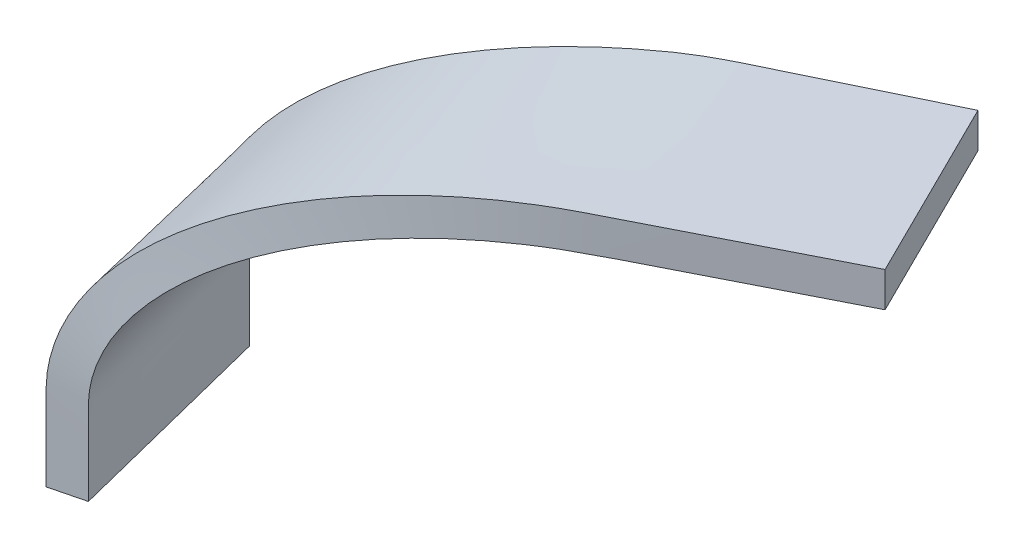
ISO-10303-21;
HEADER;
FILE_DESCRIPTION(('STEP AP214'),'2;1');
FILE_NAME('part.step','',(''),(''),'','','');
FILE_SCHEMA(('AUTOMOTIVE_DESIGN { 1 0 10303 214 1 1 1 1 }'));
ENDSEC;
DATA;
#1=APPLICATION_CONTEXT('core data for automotive mechanical design processes');
#2=APPLICATION_PROTOCOL_DEFINITION('international standard','automotive_design',2000,#1);
#3=PRODUCT_CONTEXT('',#1,'mechanical');
#4=PRODUCT('Part','Part','',(#3));
#5=PRODUCT_RELATED_PRODUCT_CATEGORY('part','',(#4));
#6=PRODUCT_DEFINITION_FORMATION('','',#4);
#7=PRODUCT_DEFINITION_CONTEXT('part definition',#1,'design');
#8=PRODUCT_DEFINITION('design','',#6,#7);
#9=PRODUCT_DEFINITION_SHAPE('','',#8);
#10=(LENGTH_UNIT() NAMED_UNIT(*) SI_UNIT(.MILLI.,.METRE.));
#11=(NAMED_UNIT(*) PLANE_ANGLE_UNIT() SI_UNIT($,.RADIAN.));
#12=(NAMED_UNIT(*) SI_UNIT($,.STERADIAN.) SOLID_ANGLE_UNIT());
#13=UNCERTAINTY_MEASURE_WITH_UNIT(LENGTH_MEASURE(1.E-05),#10,'distance_accuracy_value','');
#14=(GEOMETRIC_REPRESENTATION_CONTEXT(3) GLOBAL_UNCERTAINTY_ASSIGNED_CONTEXT((#13)) GLOBAL_UNIT_ASSIGNED_CONTEXT((#10,
#11,#12)) REPRESENTATION_CONTEXT('',''));
#15=CARTESIAN_POINT('',(0.,0.,0.));
#16=DIRECTION('',(0.,0.,1.));
#17=DIRECTION('',(1.,0.,0.));
#18=AXIS2_PLACEMENT_3D('',#15,#16,#17);
#19=CARTESIAN_POINT('',(-41.1260862397596,37.2872000000002,46.2476464193008));
#20=DIRECTION('',(-0.895876887440576,0.,0.444302377384801));
#21=DIRECTION('',(-0.430916442150004,-0.24361501178605,-0.868885922269009));
#22=AXIS2_PLACEMENT_3D('',#19,#20,#21);
#23=PLANE('',#22);
#24=CARTESIAN_POINT('',(-41.1260862397597,33.2872000000002,46.2476464193009));
#25=CARTESIAN_POINT('',(-41.1260862397596,37.2872000000002,46.2476464193008));
#26=B_SPLINE_CURVE_WITH_KNOTS('',1,(#24,#25),.UNSPECIFIED.,.F.,.F.,(2,2),(0.,1.),.UNSPECIFIED.);
#27=CARTESIAN_POINT('',(-41.1260862397596,37.2872000000002,46.2476464193008));
#28=VERTEX_POINT('',#27);
#29=CARTESIAN_POINT('',(-41.1260862397597,33.2872000000002,46.2476464193009));
#30=VERTEX_POINT('',#29);
#31=EDGE_CURVE('E81',#28,#30,#26,.F.);
#32=ORIENTED_EDGE('',*,*,#31,.T.);
#33=CARTESIAN_POINT('',(-51.5957546786409,33.2871999999997,25.1369469250321));
#34=CARTESIAN_POINT('',(-41.1260862397597,33.2872000000002,46.2476464193009));
#35=B_SPLINE_CURVE_WITH_KNOTS('',1,(#33,#34),.UNSPECIFIED.,.F.,.F.,(2,2),(0.,1.),.UNSPECIFIED.);
#36=CARTESIAN_POINT('',(-51.5957546786409,33.2871999999997,25.1369469250321));
#37=VERTEX_POINT('',#36);
#38=EDGE_CURVE('E89',#30,#37,#35,.F.);
#39=ORIENTED_EDGE('',*,*,#38,.T.);
#40=CARTESIAN_POINT('',(-51.5957546786408,37.2871999999998,25.136946925032));
#41=CARTESIAN_POINT('',(-51.5957546786409,33.2871999999997,25.1369469250321));
#42=B_SPLINE_CURVE_WITH_KNOTS('',1,(#40,#41),.UNSPECIFIED.,.F.,.F.,(2,2),(0.,1.),.UNSPECIFIED.);
#43=CARTESIAN_POINT('',(-51.5957546786408,37.2871999999998,25.136946925032));
#44=VERTEX_POINT('',#43);
#45=EDGE_CURVE('E95',#37,#44,#42,.F.);
#46=ORIENTED_EDGE('',*,*,#45,.T.);
#47=CARTESIAN_POINT('',(-41.1260862397596,37.2872000000002,46.2476464193008));
#48=CARTESIAN_POINT('',(-51.5957546786408,37.2871999999998,25.136946925032));
#49=B_SPLINE_CURVE_WITH_KNOTS('',1,(#47,#48),.UNSPECIFIED.,.F.,.F.,(2,2),(0.,1.),.UNSPECIFIED.);
#50=EDGE_CURVE('E99',#44,#28,#49,.F.);
#51=ORIENTED_EDGE('',*,*,#50,.T.);
#52=EDGE_LOOP('',(#32,#39,#46,#51));
#53=FACE_BOUND('',#52,.T.);
#54=ADVANCED_FACE('F30',(#53),#23,.F.);
#55=CARTESIAN_POINT('',(-104.907564401599,0.,78.5797700516447));
#56=DIRECTION('',(0.,-1.,0.));
#57=DIRECTION('',(0.,0.,-1.));
#58=AXIS2_PLACEMENT_3D('',#55,#56,#57);
#59=PLANE('',#58);
#60=CARTESIAN_POINT('',(-104.907564401599,0.,78.5797700516447));
#61=CARTESIAN_POINT('',(-104.745919065719,0.,78.5391675496803));
#62=CARTESIAN_POINT('',(-104.584273729838,0.,78.498565047716));
#63=CARTESIAN_POINT('',(-104.260983058076,0.,78.4173600437873));
#64=CARTESIAN_POINT('',(-104.099337722196,0.,78.376757541823));
#65=CARTESIAN_POINT('',(-103.776047050434,0.,78.2955525378943));
#66=CARTESIAN_POINT('',(-103.614401714553,0.,78.2549500359299));
#67=CARTESIAN_POINT('',(-103.291111042792,0.,78.1737450320012));
#68=CARTESIAN_POINT('',(-103.129465706911,0.,78.1331425300369));
#69=CARTESIAN_POINT('',(-102.806175035149,0.,78.0519375261083));
#70=CARTESIAN_POINT('',(-102.644529699268,0.,78.0113350241439));
#71=CARTESIAN_POINT('',(-102.321239027507,0.,77.9301300202152));
#72=CARTESIAN_POINT('',(-102.159593691626,0.,77.8895275182509));
#73=CARTESIAN_POINT('',(-101.836303019864,0.,77.8083225143222));
#74=CARTESIAN_POINT('',(-101.674657683984,0.,77.7677200123579));
#75=CARTESIAN_POINT('',(-101.351367012222,0.,77.6865150084292));
#76=CARTESIAN_POINT('',(-101.189721676341,0.,77.6459125064649));
#77=CARTESIAN_POINT('',(-101.02807634046,0.,77.6053100045005));
#78=B_SPLINE_CURVE_WITH_KNOTS('',3,(#60,#61,#62,#63,#64,#65,#66,#67,#68,#69,#70,#71,#72,#73,#74,
#75,#76,#77),.UNSPECIFIED.,.F.,.F.,(4,2,2,2,2,2,2,2,4),(0.,0.499999999999991,0.999999999999998,
1.49999999999999,2.,2.49999999999999,2.99999999999999,3.5,3.99999999999999),.UNSPECIFIED.);
#79=CARTESIAN_POINT('',(-104.907564401599,0.,78.5797700516447));
#80=VERTEX_POINT('',#79);
#81=CARTESIAN_POINT('',(-101.02807634046,0.,77.6053100045005));
#82=VERTEX_POINT('',#81);
#83=EDGE_CURVE('E84',#80,#82,#78,.T.);
#84=ORIENTED_EDGE('',*,*,#83,.F.);
#85=CARTESIAN_POINT('',(-111.095385700965,0.,53.9450208634108));
#86=CARTESIAN_POINT('',(-104.907564401599,0.,78.5797700516447));
#87=B_SPLINE_CURVE_WITH_KNOTS('',1,(#85,#86),.UNSPECIFIED.,.F.,.F.,(2,2),(0.,1.),.UNSPECIFIED.);
#88=CARTESIAN_POINT('',(-111.095385700965,0.,53.9450208634108));
#89=VERTEX_POINT('',#88);
#90=EDGE_CURVE('E156',#89,#80,#87,.T.);
#91=ORIENTED_EDGE('',*,*,#90,.F.);
#92=CARTESIAN_POINT('',(-107.215897639826,0.,52.9705608162665));
#93=CARTESIAN_POINT('',(-111.095385700965,0.,53.9450208634108));
#94=B_SPLINE_CURVE_WITH_KNOTS('',1,(#92,#93),.UNSPECIFIED.,.F.,.F.,(2,2),(0.,1.),.UNSPECIFIED.);
#95=CARTESIAN_POINT('',(-107.215897639826,0.,52.9705608162665));
#96=VERTEX_POINT('',#95);
#97=EDGE_CURVE('E42',#96,#89,#94,.T.);
#98=ORIENTED_EDGE('',*,*,#97,.F.);
#99=CARTESIAN_POINT('',(-101.02807634046,0.,77.6053100045005));
#100=CARTESIAN_POINT('',(-107.215897639826,0.,52.9705608162665));
#101=B_SPLINE_CURVE_WITH_KNOTS('',1,(#99,#100),.UNSPECIFIED.,.F.,.F.,(2,2),(0.,1.),.UNSPECIFIED.);
#102=EDGE_CURVE('E11',#82,#96,#101,.T.);
#103=ORIENTED_EDGE('',*,*,#102,.F.);
#104=EDGE_LOOP('',(#84,#91,#98,#103));
#105=FACE_BOUND('',#104,.T.);
#106=ADVANCED_FACE('F32',(#105),#59,.T.);
#107=CARTESIAN_POINT('',(-104.907564401599,0.,78.5797700516447));
#108=CARTESIAN_POINT('',(-104.907474341591,0.530024261923711,78.5797243984013));
#109=CARTESIAN_POINT('',(-104.907294221573,1.59007278577113,78.5796330919147));
#110=CARTESIAN_POINT('',(-104.90909542175,3.6895875472969,78.5805461567813));
#111=CARTESIAN_POINT('',(-104.895136120375,6.46834814547221,78.5734699040649));
#112=CARTESIAN_POINT('',(-104.94126605401,8.56221851554761,78.5968541021284));
#113=CARTESIAN_POINT('',(-104.862049533138,11.2228477875182,78.5566976425806));
#114=CARTESIAN_POINT('',(-104.589405424555,13.168585810475,78.4184888195741));
#115=CARTESIAN_POINT('',(-104.16274129642,14.8853956870833,78.2022041279964));
#116=CARTESIAN_POINT('',(-103.683980224775,16.2653169832631,77.9595104398515));
#117=CARTESIAN_POINT('',(-103.330689250407,17.1557554540182,77.7804200866173));
#118=CARTESIAN_POINT('',(-102.587484851056,18.8118895830798,77.4036747176066));
#119=CARTESIAN_POINT('',(-101.752700044016,20.2455341027319,76.9805053842912));
#120=CARTESIAN_POINT('',(-100.617544253276,21.8913240184983,76.4050719132181));
#121=CARTESIAN_POINT('',(-99.1960671295885,23.7379615046125,75.6844963571695));
#122=CARTESIAN_POINT('',(-97.1345060758906,25.8467733647453,74.6394492870154));
#123=CARTESIAN_POINT('',(-94.8178731894743,27.7756926172466,73.4651011371233));
#124=CARTESIAN_POINT('',(-92.826186522466,29.2117288004919,72.4554748095074));
#125=CARTESIAN_POINT('',(-90.7515566879051,30.5121173144082,71.4038029098136));
#126=CARTESIAN_POINT('',(-88.8069242491093,31.5741096828853,70.4180293242324));
#127=CARTESIAN_POINT('',(-86.4434756435808,32.7228276755716,69.2199493373845));
#128=CARTESIAN_POINT('',(-84.0557456417132,33.7115548229317,68.0095606190653));
#129=CARTESIAN_POINT('',(-80.5050179943899,34.938796744172,66.2096248286503));
#130=CARTESIAN_POINT('',(-77.8903649218226,35.6331297667056,64.8842042078699));
#131=CARTESIAN_POINT('',(-75.3434673423884,36.1728855381464,63.5931302191199));
#132=CARTESIAN_POINT('',(-72.8004666026459,36.6511184612596,62.3040316175821));
#133=CARTESIAN_POINT('',(-70.1235654470185,36.9846745566802,60.9470561818408));
#134=CARTESIAN_POINT('',(-67.5930014131707,37.1718067003729,59.6642619983263));
#135=CARTESIAN_POINT('',(-65.9414637625203,37.2617828889128,58.8270640994722));
#136=CARTESIAN_POINT('',(-63.3598978569767,37.2998539415695,57.5184160336142));
#137=CARTESIAN_POINT('',(-59.9639128176467,37.2829880091335,55.7969224071771));
#138=CARTESIAN_POINT('',(-56.2558349275188,37.2883366308153,53.9172225908871));
#139=CARTESIAN_POINT('',(-52.470014023345,37.2869025821487,51.9981132655645));
#140=CARTESIAN_POINT('',(-48.6966984290211,37.2872814567926,50.0853431351815));
#141=CARTESIAN_POINT('',(-44.9201062537155,37.2871797333362,48.1709120395105));
#142=CARTESIAN_POINT('',(-42.3846732881964,37.2871932769569,46.885649695877));
#143=CARTESIAN_POINT('',(-41.1260862397596,37.2872000000002,46.2476464193008));
#144=CARTESIAN_POINT('',(-101.02807634046,0.,77.6053100045005));
#145=CARTESIAN_POINT('',(-101.028003768877,0.529304942064774,77.6052691403556));
#146=CARTESIAN_POINT('',(-101.027858625711,1.58791482619432,77.6051874120657));
#147=CARTESIAN_POINT('',(-101.029310057375,3.70181598489883,77.6060046949643));
#148=CARTESIAN_POINT('',(-101.018061461981,6.36908200493889,77.5996707525005));
#149=CARTESIAN_POINT('',(-101.05523359152,8.83139756805719,77.6206019107043));
#150=CARTESIAN_POINT('',(-100.991399838826,10.8593151921951,77.5846579281304));
#151=CARTESIAN_POINT('',(-100.771001815941,12.424668272649,77.4608650481266));
#152=CARTESIAN_POINT('',(-100.424455406766,13.7925317531307,77.2667221072024));
#153=CARTESIAN_POINT('',(-100.032988780406,14.9050012233247,77.04854478219));
#154=CARTESIAN_POINT('',(-99.7424255043133,15.6270960244474,76.8871526988592));
#155=CARTESIAN_POINT('',(-99.1280867877931,16.9781825734558,76.5469504206124));
#156=CARTESIAN_POINT('',(-98.4297526262369,18.1651711364299,76.1625496340922));
#157=CARTESIAN_POINT('',(-97.469436217775,19.5424056010831,75.6376095428276));
#158=CARTESIAN_POINT('',(-96.2548357314385,21.1061106770065,74.9769507496324));
#159=CARTESIAN_POINT('',(-94.4598283969739,22.930484554191,74.0084226865298));
#160=CARTESIAN_POINT('',(-92.4070898403774,24.6284107512637,72.9099514036202));
#161=CARTESIAN_POINT('',(-90.6195053291352,25.9096788517935,71.9576555387045));
#162=CARTESIAN_POINT('',(-88.7424303221268,27.0791637946352,70.9602428437524));
#163=CARTESIAN_POINT('',(-86.9679885107722,28.0426187524312,70.0206225464053));
#164=CARTESIAN_POINT('',(-84.7965779436898,29.0917286076833,68.8728247438511));
#165=CARTESIAN_POINT('',(-82.5903221277785,29.9995936178605,67.7077214365015));
#166=CARTESIAN_POINT('',(-79.2912619089298,31.1316178466544,65.968358579643));
#167=CARTESIAN_POINT('',(-76.8454356755353,31.7756262569369,64.6793600367735));
#168=CARTESIAN_POINT('',(-74.459744308688,32.2751648458241,63.4214162886885));
#169=CARTESIAN_POINT('',(-72.0737249079787,32.7179332874046,62.163343380644));
#170=CARTESIAN_POINT('',(-69.5545105041273,33.0254297833767,60.8337163537972));
#171=CARTESIAN_POINT('',(-67.1725460172099,33.1947310805598,59.5740915877362));
#172=CARTESIAN_POINT('',(-65.6181616200256,33.2750885120814,58.7526477750727));
#173=CARTESIAN_POINT('',(-63.1783148456302,33.3025235554006,57.4538965889869));
#174=CARTESIAN_POINT('',(-60.0243545370231,33.2820994014999,55.8183983488833));
#175=CARTESIAN_POINT('',(-56.2395243696532,33.2885764268763,53.9114271801422));
#176=CARTESIAN_POINT('',(-52.474281944831,33.2868398356277,51.9996297285968));
#177=CARTESIAN_POINT('',(-48.6955295308095,33.287298641808,50.0849278063308));
#178=CARTESIAN_POINT('',(-44.9203970786621,33.2871754576593,48.17101537442));
#179=CARTESIAN_POINT('',(-42.3847697633098,33.2871918585902,46.8856839750792));
#180=CARTESIAN_POINT('',(-41.1260862397597,33.2872000000002,46.2476464193009));
#181=B_SPLINE_SURFACE_WITH_KNOTS('',1,3,((#107,#108,#109,#110,#111,#112,#113,#114,#115,#116,
#117,#118,#119,#120,#121,#122,#123,#124,#125,#126,#127,#128,#129,#130,#131,#132,#133,#134,#135,
#136,#137,#138,#139,#140,#141,#142,#143),(#144,#145,#146,#147,#148,#149,#150,#151,#152,#153,
#154,#155,#156,#157,#158,#159,#160,#161,#162,#163,#164,#165,#166,#167,#168,#169,#170,#171,#172,
#173,#174,#175,#176,#177,#178,#179,#180)),.UNSPECIFIED.,.F.,.F.,.F.,(2,2),(4,1,1,1,1,1,1,1,1,1,
1,1,1,1,1,1,1,1,1,1,1,1,1,1,1,1,1,1,1,1,1,1,1,1,4),(0.,1.),(0.,0.0180626576369154,
0.0361253152738308,0.0722506305476616,0.108375945821493,0.122591981936243,0.137320264815077,
0.159948929397299,0.168913844816561,0.176729264755243,0.186162570162067,0.219314589509946,
0.224224485366289,0.245295209181642,0.289704653649181,0.317038205465628,0.343930831985362,
0.371984695462323,0.400556771770043,0.420750408763479,0.464247920479905,0.492340159588269,
0.555786941977682,0.56256774150263,0.587645739320795,0.650787551344069,0.662158053163203,
0.681772992108985,0.712200197343425,0.758462546750046,0.807333505494731,0.855500129121049,
0.902967978654991,0.951833376386086,1.),.UNSPECIFIED.);
#182=CARTESIAN_POINT('',(-101.02807634046,0.,77.6053100045005));
#183=CARTESIAN_POINT('',(-101.028003768877,0.529304942064774,77.6052691403556));
#184=CARTESIAN_POINT('',(-101.027858625711,1.58791482619432,77.6051874120657));
#185=CARTESIAN_POINT('',(-101.029310057375,3.70181598489883,77.6060046949643));
#186=CARTESIAN_POINT('',(-101.018061461981,6.36908200493889,77.5996707525005));
#187=CARTESIAN_POINT('',(-101.05523359152,8.83139756805719,77.6206019107043));
#188=CARTESIAN_POINT('',(-100.991399838826,10.8593151921951,77.5846579281304));
#189=CARTESIAN_POINT('',(-100.771001815941,12.424668272649,77.4608650481266));
#190=CARTESIAN_POINT('',(-100.424455406766,13.7925317531307,77.2667221072024));
#191=CARTESIAN_POINT('',(-100.032988780406,14.9050012233247,77.04854478219));
#192=CARTESIAN_POINT('',(-99.7424255043133,15.6270960244474,76.8871526988592));
#193=CARTESIAN_POINT('',(-99.1280867877931,16.9781825734558,76.5469504206124));
#194=CARTESIAN_POINT('',(-98.4297526262369,18.1651711364299,76.1625496340922));
#195=CARTESIAN_POINT('',(-97.469436217775,19.5424056010831,75.6376095428276));
#196=CARTESIAN_POINT('',(-96.2548357314385,21.1061106770065,74.9769507496324));
#197=CARTESIAN_POINT('',(-94.4598283969739,22.930484554191,74.0084226865298));
#198=CARTESIAN_POINT('',(-92.4070898403774,24.6284107512637,72.9099514036202));
#199=CARTESIAN_POINT('',(-90.6195053291352,25.9096788517935,71.9576555387045));
#200=CARTESIAN_POINT('',(-88.7424303221268,27.0791637946352,70.9602428437524));
#201=CARTESIAN_POINT('',(-86.9679885107722,28.0426187524312,70.0206225464053));
#202=CARTESIAN_POINT('',(-84.7965779436898,29.0917286076833,68.8728247438511));
#203=CARTESIAN_POINT('',(-82.5903221277785,29.9995936178605,67.7077214365015));
#204=CARTESIAN_POINT('',(-79.2912619089298,31.1316178466544,65.968358579643));
#205=CARTESIAN_POINT('',(-76.8454356755353,31.7756262569369,64.6793600367735));
#206=CARTESIAN_POINT('',(-74.459744308688,32.2751648458241,63.4214162886885));
#207=CARTESIAN_POINT('',(-72.0737249079787,32.7179332874046,62.163343380644));
#208=CARTESIAN_POINT('',(-69.5545105041273,33.0254297833767,60.8337163537972));
#209=CARTESIAN_POINT('',(-67.1725460172099,33.1947310805598,59.5740915877362));
#210=CARTESIAN_POINT('',(-65.6181616200256,33.2750885120814,58.7526477750727));
#211=CARTESIAN_POINT('',(-63.1783148456302,33.3025235554006,57.4538965889869));
#212=CARTESIAN_POINT('',(-60.0243545370231,33.2820994014999,55.8183983488833));
#213=CARTESIAN_POINT('',(-56.2395243696532,33.2885764268763,53.9114271801422));
#214=CARTESIAN_POINT('',(-52.474281944831,33.2868398356277,51.9996297285968));
#215=CARTESIAN_POINT('',(-48.6955295308095,33.287298641808,50.0849278063308));
#216=CARTESIAN_POINT('',(-44.9203970786621,33.2871754576593,48.17101537442));
#217=CARTESIAN_POINT('',(-42.3847697633098,33.2871918585902,46.8856839750792));
#218=CARTESIAN_POINT('',(-41.1260862397597,33.2872000000002,46.2476464193009));
#219=B_SPLINE_CURVE_WITH_KNOTS('',3,(#182,#183,#184,#185,#186,#187,#188,#189,#190,#191,#192,
#193,#194,#195,#196,#197,#198,#199,#200,#201,#202,#203,#204,#205,#206,#207,#208,#209,#210,#211,
#212,#213,#214,#215,#216,#217,#218),.UNSPECIFIED.,.F.,.F.,(4,1,1,1,1,1,1,1,1,1,1,1,1,1,1,1,1,1,
1,1,1,1,1,1,1,1,1,1,1,1,1,1,1,1,4),(0.,0.0180626576369154,0.0361253152738308,0.0722506305476616,
0.108375945821493,0.122591981936243,0.137320264815077,0.159948929397299,0.168913844816561,
0.176729264755243,0.186162570162067,0.219314589509946,0.224224485366289,0.245295209181642,
0.289704653649181,0.317038205465628,0.343930831985362,0.371984695462323,0.400556771770043,
0.420750408763479,0.464247920479905,0.492340159588269,0.555786941977682,0.56256774150263,
0.587645739320795,0.650787551344069,0.662158053163203,0.681772992108985,0.712200197343425,
0.758462546750046,0.807333505494731,0.855500129121049,0.902967978654991,0.951833376386086,1.),.UNSPECIFIED.);
#220=EDGE_CURVE('E76',#82,#30,#219,.T.);
#221=CARTESIAN_POINT('',(-104.907564401599,0.,78.5797700516447));
#222=CARTESIAN_POINT('',(-104.907474341591,0.530024261923711,78.5797243984013));
#223=CARTESIAN_POINT('',(-104.907294221573,1.59007278577113,78.5796330919147));
#224=CARTESIAN_POINT('',(-104.90909542175,3.6895875472969,78.5805461567813));
#225=CARTESIAN_POINT('',(-104.895136120375,6.46834814547221,78.5734699040649));
#226=CARTESIAN_POINT('',(-104.94126605401,8.56221851554761,78.5968541021284));
#227=CARTESIAN_POINT('',(-104.862049533138,11.2228477875182,78.5566976425806));
#228=CARTESIAN_POINT('',(-104.589405424555,13.168585810475,78.4184888195741));
#229=CARTESIAN_POINT('',(-104.16274129642,14.8853956870833,78.2022041279964));
#230=CARTESIAN_POINT('',(-103.683980224775,16.2653169832631,77.9595104398515));
#231=CARTESIAN_POINT('',(-103.330689250407,17.1557554540182,77.7804200866173));
#232=CARTESIAN_POINT('',(-102.587484851056,18.8118895830798,77.4036747176066));
#233=CARTESIAN_POINT('',(-101.752700044016,20.2455341027319,76.9805053842912));
#234=CARTESIAN_POINT('',(-100.617544253276,21.8913240184983,76.4050719132181));
#235=CARTESIAN_POINT('',(-99.1960671295885,23.7379615046125,75.6844963571695));
#236=CARTESIAN_POINT('',(-97.1345060758906,25.8467733647453,74.6394492870154));
#237=CARTESIAN_POINT('',(-94.8178731894743,27.7756926172466,73.4651011371233));
#238=CARTESIAN_POINT('',(-92.826186522466,29.2117288004919,72.4554748095074));
#239=CARTESIAN_POINT('',(-90.7515566879051,30.5121173144082,71.4038029098136));
#240=CARTESIAN_POINT('',(-88.8069242491093,31.5741096828853,70.4180293242324));
#241=CARTESIAN_POINT('',(-86.4434756435808,32.7228276755716,69.2199493373845));
#242=CARTESIAN_POINT('',(-84.0557456417132,33.7115548229317,68.0095606190653));
#243=CARTESIAN_POINT('',(-80.5050179943899,34.938796744172,66.2096248286503));
#244=CARTESIAN_POINT('',(-77.8903649218226,35.6331297667056,64.8842042078699));
#245=CARTESIAN_POINT('',(-75.3434673423884,36.1728855381464,63.5931302191199));
#246=CARTESIAN_POINT('',(-72.8004666026459,36.6511184612596,62.3040316175821));
#247=CARTESIAN_POINT('',(-70.1235654470185,36.9846745566802,60.9470561818408));
#248=CARTESIAN_POINT('',(-67.5930014131707,37.1718067003729,59.6642619983263));
#249=CARTESIAN_POINT('',(-65.9414637625203,37.2617828889128,58.8270640994722));
#250=CARTESIAN_POINT('',(-63.3598978569767,37.2998539415695,57.5184160336142));
#251=CARTESIAN_POINT('',(-59.9639128176467,37.2829880091335,55.7969224071771));
#252=CARTESIAN_POINT('',(-56.2558349275188,37.2883366308153,53.9172225908871));
#253=CARTESIAN_POINT('',(-52.470014023345,37.2869025821487,51.9981132655645));
#254=CARTESIAN_POINT('',(-48.6966984290211,37.2872814567926,50.0853431351815));
#255=CARTESIAN_POINT('',(-44.9201062537155,37.2871797333362,48.1709120395105));
#256=CARTESIAN_POINT('',(-42.3846732881964,37.2871932769569,46.885649695877));
#257=CARTESIAN_POINT('',(-41.1260862397596,37.2872000000002,46.2476464193008));
#258=B_SPLINE_CURVE_WITH_KNOTS('',3,(#221,#222,#223,#224,#225,#226,#227,#228,#229,#230,#231,
#232,#233,#234,#235,#236,#237,#238,#239,#240,#241,#242,#243,#244,#245,#246,#247,#248,#249,#250,
#251,#252,#253,#254,#255,#256,#257),.UNSPECIFIED.,.F.,.F.,(4,1,1,1,1,1,1,1,1,1,1,1,1,1,1,1,1,1,
1,1,1,1,1,1,1,1,1,1,1,1,1,1,1,1,4),(0.,0.0180626576369154,0.0361253152738308,0.0722506305476616,
0.108375945821493,0.122591981936243,0.137320264815077,0.159948929397299,0.168913844816561,
0.176729264755243,0.186162570162067,0.219314589509946,0.224224485366289,0.245295209181642,
0.289704653649181,0.317038205465628,0.343930831985362,0.371984695462323,0.400556771770043,
0.420750408763479,0.464247920479905,0.492340159588269,0.555786941977682,0.56256774150263,
0.587645739320795,0.650787551344069,0.662158053163203,0.681772992108985,0.712200197343425,
0.758462546750046,0.807333505494731,0.855500129121049,0.902967978654991,0.951833376386086,1.),.UNSPECIFIED.);
#259=EDGE_CURVE('E87',#28,#80,#258,.F.);
#260=ORIENTED_EDGE('',*,*,#83,.T.);
#261=ORIENTED_EDGE('',*,*,#220,.T.);
#262=ORIENTED_EDGE('',*,*,#31,.F.);
#263=ORIENTED_EDGE('',*,*,#259,.T.);
#264=EDGE_LOOP('',(#260,#261,#262,#263));
#265=FACE_BOUND('',#264,.T.);
#266=ADVANCED_FACE('F78',(#265),#181,.T.);
#267=CARTESIAN_POINT('',(-101.02807634046,0.,77.6053100045005));
#268=CARTESIAN_POINT('',(-101.028003768877,0.529304942064774,77.6052691403556));
#269=CARTESIAN_POINT('',(-101.027858625711,1.58791482619432,77.6051874120657));
#270=CARTESIAN_POINT('',(-101.029310057375,3.70181598489883,77.6060046949643));
#271=CARTESIAN_POINT('',(-101.018061461981,6.36908200493889,77.5996707525005));
#272=CARTESIAN_POINT('',(-101.05523359152,8.83139756805719,77.6206019107043));
#273=CARTESIAN_POINT('',(-100.991399838826,10.8593151921951,77.5846579281304));
#274=CARTESIAN_POINT('',(-100.771001815941,12.424668272649,77.4608650481266));
#275=CARTESIAN_POINT('',(-100.424455406766,13.7925317531307,77.2667221072024));
#276=CARTESIAN_POINT('',(-100.032988780406,14.9050012233247,77.04854478219));
#277=CARTESIAN_POINT('',(-99.7424255043133,15.6270960244474,76.8871526988592));
#278=CARTESIAN_POINT('',(-99.1280867877931,16.9781825734558,76.5469504206124));
#279=CARTESIAN_POINT('',(-98.4297526262369,18.1651711364299,76.1625496340922));
#280=CARTESIAN_POINT('',(-97.469436217775,19.5424056010831,75.6376095428276));
#281=CARTESIAN_POINT('',(-96.2548357314385,21.1061106770065,74.9769507496324));
#282=CARTESIAN_POINT('',(-94.4598283969739,22.930484554191,74.0084226865298));
#283=CARTESIAN_POINT('',(-92.4070898403774,24.6284107512637,72.9099514036202));
#284=CARTESIAN_POINT('',(-90.6195053291352,25.9096788517935,71.9576555387045));
#285=CARTESIAN_POINT('',(-88.7424303221268,27.0791637946352,70.9602428437524));
#286=CARTESIAN_POINT('',(-86.9679885107722,28.0426187524312,70.0206225464053));
#287=CARTESIAN_POINT('',(-84.7965779436898,29.0917286076833,68.8728247438511));
#288=CARTESIAN_POINT('',(-82.5903221277785,29.9995936178605,67.7077214365015));
#289=CARTESIAN_POINT('',(-79.2912619089298,31.1316178466544,65.968358579643));
#290=CARTESIAN_POINT('',(-76.8454356755353,31.7756262569369,64.6793600367735));
#291=CARTESIAN_POINT('',(-74.459744308688,32.2751648458241,63.4214162886885));
#292=CARTESIAN_POINT('',(-72.0737249079787,32.7179332874046,62.163343380644));
#293=CARTESIAN_POINT('',(-69.5545105041273,33.0254297833767,60.8337163537972));
#294=CARTESIAN_POINT('',(-67.1725460172099,33.1947310805598,59.5740915877362));
#295=CARTESIAN_POINT('',(-65.6181616200256,33.2750885120814,58.7526477750727));
#296=CARTESIAN_POINT('',(-63.1783148456302,33.3025235554006,57.4538965889869));
#297=CARTESIAN_POINT('',(-60.0243545370231,33.2820994014999,55.8183983488833));
#298=CARTESIAN_POINT('',(-56.2395243696532,33.2885764268763,53.9114271801422));
#299=CARTESIAN_POINT('',(-52.474281944831,33.2868398356277,51.9996297285968));
#300=CARTESIAN_POINT('',(-48.6955295308095,33.287298641808,50.0849278063308));
#301=CARTESIAN_POINT('',(-44.9203970786621,33.2871754576593,48.17101537442));
#302=CARTESIAN_POINT('',(-42.3847697633098,33.2871918585902,46.8856839750792));
#303=CARTESIAN_POINT('',(-41.1260862397597,33.2872000000002,46.2476464193009));
#304=CARTESIAN_POINT('',(-107.215897639826,0.,52.9705608162665));
#305=CARTESIAN_POINT('',(-107.215868417352,0.528310902830454,52.9705434282615));
#306=CARTESIAN_POINT('',(-107.215809972404,1.58493270849136,52.9705086522516));
#307=CARTESIAN_POINT('',(-107.216394421886,3.71871465188226,52.9708564123512));
#308=CARTESIAN_POINT('',(-107.211864938395,6.23190459060277,52.9681612715789));
#309=CARTESIAN_POINT('',(-107.226833078077,9.20338026244147,52.9770676388549));
#310=CARTESIAN_POINT('',(-107.201129075143,10.3569438782163,52.9617732004368));
#311=CARTESIAN_POINT('',(-107.108605034199,11.4090737172189,52.9073849943903));
#312=CARTESIAN_POINT('',(-106.953897656659,12.3327258119012,52.8177515890692));
#313=CARTESIAN_POINT('',(-106.762644818815,13.1328481379006,52.7093811257052));
#314=CARTESIAN_POINT('',(-106.61291867472,13.6683665548884,52.6255935105299));
#315=CARTESIAN_POINT('',(-106.28136949282,14.7018096747344,52.4419574285566));
#316=CARTESIAN_POINT('',(-105.86653850468,15.6804459835934,52.2164876710403));
#317=CARTESIAN_POINT('',(-105.245411675191,16.8734096990694,51.8846913026245));
#318=CARTESIAN_POINT('',(-104.415698820226,18.2806117861731,51.4461267884155));
#319=CARTESIAN_POINT('',(-103.067848274833,20.0519016140801,50.7446297271335));
#320=CARTESIAN_POINT('',(-101.407094820708,21.7879273510948,49.8914283565043));
#321=CARTESIAN_POINT('',(-99.8988945053384,23.1464646791601,49.1214238377877));
#322=CARTESIAN_POINT('',(-98.2695740012682,24.4285002547675,48.2924372710387));
#323=CARTESIAN_POINT('',(-96.6877774126852,25.5146328086447,47.4910576672014));
#324=CARTESIAN_POINT('',(-94.7172857242797,26.7286021855848,46.4948001129546));
#325=CARTESIAN_POINT('',(-92.6802603212296,27.822657110311,45.4660546007766));
#326=CARTESIAN_POINT('',(-89.583096329361,29.2458211533591,43.9047868065157));
#327=CARTESIAN_POINT('',(-87.2470433709895,30.12275150542,42.7276415514172));
#328=CARTESIAN_POINT('',(-84.9470484288759,30.8599643777136,41.5681226209338));
#329=CARTESIAN_POINT('',(-82.6357126355573,31.5437968833057,40.4029272524971));
#330=CARTESIAN_POINT('',(-80.1677974921597,32.1203683588649,39.1575206681095));
#331=CARTESIAN_POINT('',(-77.814645664566,32.5594966064089,37.9677510594871));
#332=CARTESIAN_POINT('',(-76.2731680652213,32.8135558379123,37.1889724925129));
#333=CARTESIAN_POINT('',(-73.8411587769809,33.1654201761584,35.9507939007947));
#334=CARTESIAN_POINT('',(-70.6590506321617,33.3277356309695,34.3759045465115));
#335=CARTESIAN_POINT('',(-66.8413251542609,33.2762612186186,32.5340406859301));
#336=CARTESIAN_POINT('',(-63.0431246169379,33.2900623092151,30.6890264665472));
#337=CARTESIAN_POINT('',(-59.2313585571641,33.2864160708356,28.8408056453925));
#338=CARTESIAN_POINT('',(-55.4232275175783,33.2873950436356,26.9934537293326));
#339=CARTESIAN_POINT('',(-52.8654390043984,33.28726470166,25.7528043561033));
#340=CARTESIAN_POINT('',(-51.5957546786409,33.2871999999997,25.1369469250321));
#341=B_SPLINE_SURFACE_WITH_KNOTS('',1,3,((#267,#268,#269,#270,#271,#272,#273,#274,#275,#276,
#277,#278,#279,#280,#281,#282,#283,#284,#285,#286,#287,#288,#289,#290,#291,#292,#293,#294,#295,
#296,#297,#298,#299,#300,#301,#302,#303),(#304,#305,#306,#307,#308,#309,#310,#311,#312,#313,
#314,#315,#316,#317,#318,#319,#320,#321,#322,#323,#324,#325,#326,#327,#328,#329,#330,#331,#332,
#333,#334,#335,#336,#337,#338,#339,#340)),.UNSPECIFIED.,.F.,.F.,.F.,(2,2),(4,1,1,1,1,1,1,1,1,1,
1,1,1,1,1,1,1,1,1,1,1,1,1,1,1,1,1,1,1,1,1,1,1,1,4),(0.,1.),(0.,0.0180626576369154,
0.0361253152738308,0.0722506305476616,0.108375945821493,0.122591981936243,0.137320264815077,
0.159948929397299,0.168913844816561,0.176729264755243,0.186162570162067,0.219314589509946,
0.224224485366289,0.245295209181642,0.289704653649181,0.317038205465628,0.343930831985362,
0.371984695462323,0.400556771770043,0.420750408763479,0.464247920479905,0.492340159588269,
0.555786941977682,0.56256774150263,0.587645739320795,0.650787551344069,0.662158053163203,
0.681772992108985,0.712200197343425,0.758462546750046,0.807333505494731,0.855500129121049,
0.902967978654991,0.951833376386086,1.),.UNSPECIFIED.);
#342=CARTESIAN_POINT('',(-107.215897639826,0.,52.9705608162665));
#343=CARTESIAN_POINT('',(-107.215868417352,0.528310902830454,52.9705434282615));
#344=CARTESIAN_POINT('',(-107.215809972404,1.58493270849136,52.9705086522516));
#345=CARTESIAN_POINT('',(-107.216394421886,3.71871465188226,52.9708564123512));
#346=CARTESIAN_POINT('',(-107.211864938395,6.23190459060277,52.9681612715789));
#347=CARTESIAN_POINT('',(-107.226833078077,9.20338026244147,52.9770676388549));
#348=CARTESIAN_POINT('',(-107.201129075143,10.3569438782163,52.9617732004368));
#349=CARTESIAN_POINT('',(-107.108605034199,11.4090737172189,52.9073849943903));
#350=CARTESIAN_POINT('',(-106.953897656659,12.3327258119012,52.8177515890692));
#351=CARTESIAN_POINT('',(-106.762644818815,13.1328481379006,52.7093811257052));
#352=CARTESIAN_POINT('',(-106.61291867472,13.6683665548884,52.6255935105299));
#353=CARTESIAN_POINT('',(-106.28136949282,14.7018096747344,52.4419574285566));
#354=CARTESIAN_POINT('',(-105.86653850468,15.6804459835934,52.2164876710403));
#355=CARTESIAN_POINT('',(-105.245411675191,16.8734096990694,51.8846913026245));
#356=CARTESIAN_POINT('',(-104.415698820226,18.2806117861731,51.4461267884155));
#357=CARTESIAN_POINT('',(-103.067848274833,20.0519016140801,50.7446297271335));
#358=CARTESIAN_POINT('',(-101.407094820708,21.7879273510948,49.8914283565043));
#359=CARTESIAN_POINT('',(-99.8988945053384,23.1464646791601,49.1214238377877));
#360=CARTESIAN_POINT('',(-98.2695740012682,24.4285002547675,48.2924372710387));
#361=CARTESIAN_POINT('',(-96.6877774126852,25.5146328086447,47.4910576672014));
#362=CARTESIAN_POINT('',(-94.7172857242797,26.7286021855848,46.4948001129546));
#363=CARTESIAN_POINT('',(-92.6802603212296,27.822657110311,45.4660546007766));
#364=CARTESIAN_POINT('',(-89.583096329361,29.2458211533591,43.9047868065157));
#365=CARTESIAN_POINT('',(-87.2470433709895,30.12275150542,42.7276415514172));
#366=CARTESIAN_POINT('',(-84.9470484288759,30.8599643777136,41.5681226209338));
#367=CARTESIAN_POINT('',(-82.6357126355573,31.5437968833057,40.4029272524971));
#368=CARTESIAN_POINT('',(-80.1677974921597,32.1203683588649,39.1575206681095));
#369=CARTESIAN_POINT('',(-77.814645664566,32.5594966064089,37.9677510594871));
#370=CARTESIAN_POINT('',(-76.2731680652213,32.8135558379123,37.1889724925129));
#371=CARTESIAN_POINT('',(-73.8411587769809,33.1654201761584,35.9507939007947));
#372=CARTESIAN_POINT('',(-70.6590506321617,33.3277356309695,34.3759045465115));
#373=CARTESIAN_POINT('',(-66.8413251542609,33.2762612186186,32.5340406859301));
#374=CARTESIAN_POINT('',(-63.0431246169379,33.2900623092151,30.6890264665472));
#375=CARTESIAN_POINT('',(-59.2313585571641,33.2864160708356,28.8408056453925));
#376=CARTESIAN_POINT('',(-55.4232275175783,33.2873950436356,26.9934537293326));
#377=CARTESIAN_POINT('',(-52.8654390043984,33.28726470166,25.7528043561033));
#378=CARTESIAN_POINT('',(-51.5957546786409,33.2871999999997,25.1369469250321));
#379=B_SPLINE_CURVE_WITH_KNOTS('',3,(#342,#343,#344,#345,#346,#347,#348,#349,#350,#351,#352,
#353,#354,#355,#356,#357,#358,#359,#360,#361,#362,#363,#364,#365,#366,#367,#368,#369,#370,#371,
#372,#373,#374,#375,#376,#377,#378),.UNSPECIFIED.,.F.,.F.,(4,1,1,1,1,1,1,1,1,1,1,1,1,1,1,1,1,1,
1,1,1,1,1,1,1,1,1,1,1,1,1,1,1,1,4),(0.,0.0180626576369154,0.0361253152738308,0.0722506305476616,
0.108375945821493,0.122591981936243,0.137320264815077,0.159948929397299,0.168913844816561,
0.176729264755243,0.186162570162067,0.219314589509946,0.224224485366289,0.245295209181642,
0.289704653649181,0.317038205465628,0.343930831985362,0.371984695462323,0.400556771770043,
0.420750408763479,0.464247920479905,0.492340159588269,0.555786941977682,0.56256774150263,
0.587645739320795,0.650787551344069,0.662158053163203,0.681772992108985,0.712200197343425,
0.758462546750046,0.807333505494731,0.855500129121049,0.902967978654991,0.951833376386086,1.),.UNSPECIFIED.);
#380=EDGE_CURVE('E49',#96,#37,#379,.T.);
#381=ORIENTED_EDGE('',*,*,#102,.T.);
#382=ORIENTED_EDGE('',*,*,#380,.T.);
#383=ORIENTED_EDGE('',*,*,#38,.F.);
#384=ORIENTED_EDGE('',*,*,#220,.F.);
#385=EDGE_LOOP('',(#381,#382,#383,#384));
#386=FACE_BOUND('',#385,.T.);
#387=ADVANCED_FACE('F91',(#386),#341,.T.);
#388=CARTESIAN_POINT('',(-111.095385700965,0.,53.9450208634108));
#389=CARTESIAN_POINT('',(-111.095338990065,0.529030222689391,53.9449986863074));
#390=CARTESIAN_POINT('',(-111.095245568266,1.58709066806817,53.9449543321006));
#391=CARTESIAN_POINT('',(-111.096179786262,3.70648621428033,53.9453978741684));
#392=CARTESIAN_POINT('',(-111.088939596789,6.33117073113609,53.9419604231434));
#393=CARTESIAN_POINT('',(-111.112865540567,8.93420120993189,53.9533198302793));
#394=CARTESIAN_POINT('',(-111.071778769456,10.7204764735394,53.933812914887));
#395=CARTESIAN_POINT('',(-110.927008642814,12.1529912550449,53.8650087658378));
#396=CARTESIAN_POINT('',(-110.692183546314,13.4255897458538,53.7532336098632));
#397=CARTESIAN_POINT('',(-110.413636263183,14.493163897839,53.6203467833666));
#398=CARTESIAN_POINT('',(-110.201182420814,15.1970259844592,53.518860898288));
#399=CARTESIAN_POINT('',(-109.740767556083,16.5355166843585,53.2986817255508));
#400=CARTESIAN_POINT('',(-109.189485922459,17.7608089498955,53.0344434212394));
#401=CARTESIAN_POINT('',(-108.393519710692,19.2223281164846,52.6521536730148));
#402=CARTESIAN_POINT('',(-107.356930218376,20.9124626137791,52.1536723959526));
#403=CARTESIAN_POINT('',(-105.742525953749,22.9681904246344,51.3756563276191));
#404=CARTESIAN_POINT('',(-103.817878169805,24.9352092170777,50.4465780900074));
#405=CARTESIAN_POINT('',(-102.105575698669,26.4485146278584,49.6192431085905));
#406=CARTESIAN_POINT('',(-100.278700367047,27.8614537745405,48.7359973370999));
#407=CARTESIAN_POINT('',(-98.5267131510223,29.0461237390987,47.8884644450285));
#408=CARTESIAN_POINT('',(-96.3641834241707,30.3597012534731,46.841924706488));
#409=CARTESIAN_POINT('',(-94.1456838351643,31.5346183153822,45.7678937833403));
#410=CARTESIAN_POINT('',(-90.7968524148212,33.0530000508767,44.146053055523));
#411=CARTESIAN_POINT('',(-88.2919726172768,33.9802550151887,42.9324857225136));
#412=CARTESIAN_POINT('',(-85.8307714625763,34.7576850700359,41.7398365513652));
#413=CARTESIAN_POINT('',(-83.3624543302246,35.4769820571608,40.5436154894352));
#414=CARTESIAN_POINT('',(-80.736852435051,36.0796131321683,39.2708604961531));
#415=CARTESIAN_POINT('',(-78.2351010605267,36.536572226222,38.0579214700773));
#416=CARTESIAN_POINT('',(-76.596470207716,36.8002502147438,37.2633888169124));
#417=CARTESIAN_POINT('',(-74.0227417883275,37.1627505623273,36.015313345422));
#418=CARTESIAN_POINT('',(-70.5986089127853,37.3286242386031,34.3544286048054));
#419=CARTESIAN_POINT('',(-66.8576357121267,37.2760214225575,32.5398360966749));
#420=CARTESIAN_POINT('',(-63.0388566954519,37.2901250557361,30.6875100035149));
#421=CARTESIAN_POINT('',(-59.2325274553758,37.2863988858202,28.8412209742432));
#422=CARTESIAN_POINT('',(-55.4229366926318,37.2873993193126,26.993350394423));
#423=CARTESIAN_POINT('',(-52.865342529285,37.2872661200267,25.7527700769011));
#424=CARTESIAN_POINT('',(-51.5957546786408,37.2871999999998,25.136946925032));
#425=CARTESIAN_POINT('',(-104.907564401599,0.,78.5797700516447));
#426=CARTESIAN_POINT('',(-104.907474341591,0.530024261923711,78.5797243984013));
#427=CARTESIAN_POINT('',(-104.907294221573,1.59007278577113,78.5796330919147));
#428=CARTESIAN_POINT('',(-104.90909542175,3.6895875472969,78.5805461567813));
#429=CARTESIAN_POINT('',(-104.895136120375,6.46834814547221,78.5734699040649));
#430=CARTESIAN_POINT('',(-104.94126605401,8.56221851554761,78.5968541021284));
#431=CARTESIAN_POINT('',(-104.862049533138,11.2228477875182,78.5566976425806));
#432=CARTESIAN_POINT('',(-104.589405424555,13.168585810475,78.418488819574));
#433=CARTESIAN_POINT('',(-104.16274129642,14.8853956870833,78.2022041279965));
#434=CARTESIAN_POINT('',(-103.683980224775,16.2653169832631,77.9595104398515));
#435=CARTESIAN_POINT('',(-103.330689250407,17.1557554540182,77.7804200866173));
#436=CARTESIAN_POINT('',(-102.587484851056,18.8118895830798,77.4036747176066));
#437=CARTESIAN_POINT('',(-101.752700044016,20.2455341027319,76.9805053842912));
#438=CARTESIAN_POINT('',(-100.617544253276,21.8913240184983,76.405071913218));
#439=CARTESIAN_POINT('',(-99.1960671295885,23.7379615046125,75.6844963571695));
#440=CARTESIAN_POINT('',(-97.1345060758906,25.8467733647453,74.6394492870154));
#441=CARTESIAN_POINT('',(-94.8178731894744,27.7756926172466,73.4651011371233));
#442=CARTESIAN_POINT('',(-92.826186522466,29.2117288004919,72.4554748095074));
#443=CARTESIAN_POINT('',(-90.7515566879051,30.5121173144082,71.4038029098135));
#444=CARTESIAN_POINT('',(-88.8069242491093,31.5741096828853,70.4180293242324));
#445=CARTESIAN_POINT('',(-86.4434756435808,32.7228276755716,69.2199493373846));
#446=CARTESIAN_POINT('',(-84.0557456417132,33.7115548229317,68.0095606190652));
#447=CARTESIAN_POINT('',(-80.5050179943899,34.938796744172,66.2096248286503));
#448=CARTESIAN_POINT('',(-77.8903649218225,35.6331297667056,64.8842042078699));
#449=CARTESIAN_POINT('',(-75.3434673423885,36.1728855381464,63.5931302191199));
#450=CARTESIAN_POINT('',(-72.8004666026459,36.6511184612596,62.3040316175821));
#451=CARTESIAN_POINT('',(-70.1235654470185,36.9846745566802,60.9470561818408));
#452=CARTESIAN_POINT('',(-67.5930014131707,37.1718067003729,59.6642619983263));
#453=CARTESIAN_POINT('',(-65.9414637625203,37.2617828889128,58.8270640994722));
#454=CARTESIAN_POINT('',(-63.3598978569767,37.2998539415695,57.5184160336143));
#455=CARTESIAN_POINT('',(-59.9639128176467,37.2829880091335,55.7969224071771));
#456=CARTESIAN_POINT('',(-56.2558349275188,37.2883366308153,53.9172225908871));
#457=CARTESIAN_POINT('',(-52.470014023345,37.2869025821487,51.9981132655645));
#458=CARTESIAN_POINT('',(-48.6966984290211,37.2872814567926,50.0853431351816));
#459=CARTESIAN_POINT('',(-44.9201062537155,37.2871797333362,48.1709120395105));
#460=CARTESIAN_POINT('',(-42.3846732881964,37.2871932769569,46.885649695877));
#461=CARTESIAN_POINT('',(-41.1260862397596,37.2872000000002,46.2476464193008));
#462=B_SPLINE_SURFACE_WITH_KNOTS('',1,3,((#388,#389,#390,#391,#392,#393,#394,#395,#396,#397,
#398,#399,#400,#401,#402,#403,#404,#405,#406,#407,#408,#409,#410,#411,#412,#413,#414,#415,#416,
#417,#418,#419,#420,#421,#422,#423,#424),(#425,#426,#427,#428,#429,#430,#431,#432,#433,#434,
#435,#436,#437,#438,#439,#440,#441,#442,#443,#444,#445,#446,#447,#448,#449,#450,#451,#452,#453,
#454,#455,#456,#457,#458,#459,#460,#461)),.UNSPECIFIED.,.F.,.F.,.F.,(2,2),(4,1,1,1,1,1,1,1,1,1,
1,1,1,1,1,1,1,1,1,1,1,1,1,1,1,1,1,1,1,1,1,1,1,1,4),(0.,1.),(0.,0.0180626576369154,
0.0361253152738308,0.0722506305476616,0.108375945821493,0.122591981936243,0.137320264815077,
0.159948929397299,0.168913844816561,0.176729264755243,0.186162570162067,0.219314589509946,
0.224224485366289,0.245295209181642,0.289704653649181,0.317038205465628,0.343930831985362,
0.371984695462323,0.400556771770043,0.420750408763479,0.464247920479905,0.492340159588269,
0.555786941977682,0.56256774150263,0.587645739320795,0.650787551344069,0.662158053163203,
0.681772992108985,0.712200197343425,0.758462546750046,0.807333505494731,0.855500129121049,
0.902967978654991,0.951833376386086,1.),.UNSPECIFIED.);
#463=CARTESIAN_POINT('',(-111.095385700965,0.,53.9450208634108));
#464=CARTESIAN_POINT('',(-111.095338990065,0.529030222689391,53.9449986863074));
#465=CARTESIAN_POINT('',(-111.095245568266,1.58709066806817,53.9449543321006));
#466=CARTESIAN_POINT('',(-111.096179786262,3.70648621428033,53.9453978741684));
#467=CARTESIAN_POINT('',(-111.088939596789,6.33117073113609,53.9419604231433));
#468=CARTESIAN_POINT('',(-111.112865540567,8.93420120993189,53.9533198302793));
#469=CARTESIAN_POINT('',(-111.071778769456,10.7204764735394,53.933812914887));
#470=CARTESIAN_POINT('',(-110.927008642814,12.1529912550449,53.8650087658378));
#471=CARTESIAN_POINT('',(-110.692183546314,13.4255897458538,53.7532336098632));
#472=CARTESIAN_POINT('',(-110.413636263183,14.493163897839,53.6203467833667));
#473=CARTESIAN_POINT('',(-110.201182420814,15.1970259844592,53.518860898288));
#474=CARTESIAN_POINT('',(-109.740767556083,16.5355166843585,53.2986817255508));
#475=CARTESIAN_POINT('',(-109.189485922459,17.7608089498955,53.0344434212394));
#476=CARTESIAN_POINT('',(-108.393519710692,19.2223281164846,52.6521536730148));
#477=CARTESIAN_POINT('',(-107.356930218376,20.9124626137791,52.1536723959527));
#478=CARTESIAN_POINT('',(-105.742525953749,22.9681904246344,51.3756563276191));
#479=CARTESIAN_POINT('',(-103.817878169805,24.9352092170777,50.4465780900074));
#480=CARTESIAN_POINT('',(-102.105575698669,26.4485146278584,49.6192431085905));
#481=CARTESIAN_POINT('',(-100.278700367047,27.8614537745405,48.7359973370999));
#482=CARTESIAN_POINT('',(-98.5267131510223,29.0461237390988,47.8884644450285));
#483=CARTESIAN_POINT('',(-96.3641834241708,30.3597012534731,46.841924706488));
#484=CARTESIAN_POINT('',(-94.1456838351644,31.5346183153822,45.7678937833403));
#485=CARTESIAN_POINT('',(-90.7968524148211,33.0530000508767,44.146053055523));
#486=CARTESIAN_POINT('',(-88.2919726172769,33.9802550151887,42.9324857225136));
#487=CARTESIAN_POINT('',(-85.8307714625763,34.7576850700359,41.7398365513652));
#488=CARTESIAN_POINT('',(-83.3624543302246,35.4769820571608,40.5436154894352));
#489=CARTESIAN_POINT('',(-80.736852435051,36.0796131321683,39.2708604961531));
#490=CARTESIAN_POINT('',(-78.2351010605267,36.536572226222,38.0579214700773));
#491=CARTESIAN_POINT('',(-76.596470207716,36.8002502147438,37.2633888169124));
#492=CARTESIAN_POINT('',(-74.0227417883275,37.1627505623274,36.015313345422));
#493=CARTESIAN_POINT('',(-70.5986089127853,37.3286242386032,34.3544286048054));
#494=CARTESIAN_POINT('',(-66.8576357121267,37.2760214225575,32.5398360966749));
#495=CARTESIAN_POINT('',(-63.0388566954519,37.2901250557361,30.6875100035149));
#496=CARTESIAN_POINT('',(-59.2325274553758,37.2863988858202,28.8412209742432));
#497=CARTESIAN_POINT('',(-55.4229366926318,37.2873993193126,26.993350394423));
#498=CARTESIAN_POINT('',(-52.865342529285,37.2872661200267,25.7527700769011));
#499=CARTESIAN_POINT('',(-51.5957546786408,37.2871999999998,25.136946925032));
#500=B_SPLINE_CURVE_WITH_KNOTS('',3,(#463,#464,#465,#466,#467,#468,#469,#470,#471,#472,#473,
#474,#475,#476,#477,#478,#479,#480,#481,#482,#483,#484,#485,#486,#487,#488,#489,#490,#491,#492,
#493,#494,#495,#496,#497,#498,#499),.UNSPECIFIED.,.F.,.F.,(4,1,1,1,1,1,1,1,1,1,1,1,1,1,1,1,1,1,
1,1,1,1,1,1,1,1,1,1,1,1,1,1,1,1,4),(0.,0.0180626576369154,0.0361253152738308,0.0722506305476616,
0.108375945821493,0.122591981936243,0.137320264815077,0.159948929397299,0.168913844816561,
0.176729264755243,0.186162570162067,0.219314589509946,0.224224485366289,0.245295209181642,
0.289704653649181,0.317038205465628,0.343930831985362,0.371984695462323,0.400556771770043,
0.420750408763479,0.464247920479905,0.492340159588269,0.555786941977682,0.56256774150263,
0.587645739320795,0.650787551344069,0.662158053163203,0.681772992108985,0.712200197343425,
0.758462546750046,0.807333505494731,0.855500129121049,0.902967978654991,0.951833376386086,1.),.UNSPECIFIED.);
#501=EDGE_CURVE('E94',#89,#44,#500,.T.);
#502=ORIENTED_EDGE('',*,*,#90,.T.);
#503=ORIENTED_EDGE('',*,*,#259,.F.);
#504=ORIENTED_EDGE('',*,*,#50,.F.);
#505=ORIENTED_EDGE('',*,*,#501,.F.);
#506=EDGE_LOOP('',(#502,#503,#504,#505));
#507=FACE_BOUND('',#506,.T.);
#508=ADVANCED_FACE('F137',(#507),#462,.T.);
#509=CARTESIAN_POINT('',(-107.215897639826,0.,52.9705608162665));
#510=CARTESIAN_POINT('',(-107.215868417352,0.528310902830454,52.9705434282615));
#511=CARTESIAN_POINT('',(-107.215809972404,1.58493270849136,52.9705086522516));
#512=CARTESIAN_POINT('',(-107.216394421886,3.71871465188226,52.9708564123512));
#513=CARTESIAN_POINT('',(-107.211864938395,6.23190459060277,52.9681612715789));
#514=CARTESIAN_POINT('',(-107.226833078077,9.20338026244146,52.9770676388549));
#515=CARTESIAN_POINT('',(-107.201129075143,10.3569438782163,52.9617732004368));
#516=CARTESIAN_POINT('',(-107.108605034199,11.4090737172189,52.9073849943903));
#517=CARTESIAN_POINT('',(-106.953897656659,12.3327258119012,52.8177515890692));
#518=CARTESIAN_POINT('',(-106.762644818815,13.1328481379006,52.7093811257051));
#519=CARTESIAN_POINT('',(-106.61291867472,13.6683665548884,52.6255935105299));
#520=CARTESIAN_POINT('',(-106.28136949282,14.7018096747344,52.4419574285566));
#521=CARTESIAN_POINT('',(-105.86653850468,15.6804459835934,52.2164876710403));
#522=CARTESIAN_POINT('',(-105.245411675191,16.8734096990694,51.8846913026245));
#523=CARTESIAN_POINT('',(-104.415698820226,18.2806117861732,51.4461267884155));
#524=CARTESIAN_POINT('',(-103.067848274833,20.0519016140801,50.7446297271335));
#525=CARTESIAN_POINT('',(-101.407094820708,21.7879273510948,49.8914283565043));
#526=CARTESIAN_POINT('',(-99.8988945053385,23.1464646791601,49.1214238377877));
#527=CARTESIAN_POINT('',(-98.2695740012682,24.4285002547675,48.2924372710387));
#528=CARTESIAN_POINT('',(-96.6877774126852,25.5146328086447,47.4910576672014));
#529=CARTESIAN_POINT('',(-94.7172857242797,26.7286021855848,46.4948001129546));
#530=CARTESIAN_POINT('',(-92.6802603212296,27.822657110311,45.4660546007765));
#531=CARTESIAN_POINT('',(-89.583096329361,29.2458211533592,43.9047868065157));
#532=CARTESIAN_POINT('',(-87.2470433709895,30.12275150542,42.7276415514172));
#533=CARTESIAN_POINT('',(-84.9470484288759,30.8599643777136,41.5681226209338));
#534=CARTESIAN_POINT('',(-82.6357126355574,31.5437968833057,40.4029272524971));
#535=CARTESIAN_POINT('',(-80.1677974921597,32.1203683588649,39.1575206681095));
#536=CARTESIAN_POINT('',(-77.814645664566,32.5594966064089,37.9677510594871));
#537=CARTESIAN_POINT('',(-76.2731680652213,32.8135558379123,37.1889724925129));
#538=CARTESIAN_POINT('',(-73.8411587769809,33.1654201761585,35.9507939007947));
#539=CARTESIAN_POINT('',(-70.6590506321617,33.3277356309695,34.3759045465115));
#540=CARTESIAN_POINT('',(-66.8413251542609,33.2762612186186,32.5340406859301));
#541=CARTESIAN_POINT('',(-63.0431246169379,33.2900623092151,30.6890264665472));
#542=CARTESIAN_POINT('',(-59.2313585571641,33.2864160708356,28.8408056453925));
#543=CARTESIAN_POINT('',(-55.4232275175783,33.2873950436356,26.9934537293326));
#544=CARTESIAN_POINT('',(-52.8654390043984,33.28726470166,25.7528043561033));
#545=CARTESIAN_POINT('',(-51.5957546786409,33.2871999999997,25.1369469250321));
#546=CARTESIAN_POINT('',(-111.095385700965,0.,53.9450208634108));
#547=CARTESIAN_POINT('',(-111.095338990065,0.529030222689391,53.9449986863074));
#548=CARTESIAN_POINT('',(-111.095245568266,1.58709066806817,53.9449543321006));
#549=CARTESIAN_POINT('',(-111.096179786262,3.70648621428033,53.9453978741684));
#550=CARTESIAN_POINT('',(-111.088939596789,6.33117073113609,53.9419604231433));
#551=CARTESIAN_POINT('',(-111.112865540567,8.93420120993189,53.9533198302793));
#552=CARTESIAN_POINT('',(-111.071778769456,10.7204764735394,53.933812914887));
#553=CARTESIAN_POINT('',(-110.927008642814,12.1529912550449,53.8650087658378));
#554=CARTESIAN_POINT('',(-110.692183546314,13.4255897458538,53.7532336098632));
#555=CARTESIAN_POINT('',(-110.413636263183,14.493163897839,53.6203467833667));
#556=CARTESIAN_POINT('',(-110.201182420814,15.1970259844592,53.518860898288));
#557=CARTESIAN_POINT('',(-109.740767556083,16.5355166843585,53.2986817255508));
#558=CARTESIAN_POINT('',(-109.189485922459,17.7608089498955,53.0344434212394));
#559=CARTESIAN_POINT('',(-108.393519710692,19.2223281164846,52.6521536730148));
#560=CARTESIAN_POINT('',(-107.356930218376,20.9124626137791,52.1536723959527));
#561=CARTESIAN_POINT('',(-105.742525953749,22.9681904246344,51.3756563276191));
#562=CARTESIAN_POINT('',(-103.817878169805,24.9352092170777,50.4465780900074));
#563=CARTESIAN_POINT('',(-102.105575698669,26.4485146278584,49.6192431085905));
#564=CARTESIAN_POINT('',(-100.278700367047,27.8614537745405,48.7359973370999));
#565=CARTESIAN_POINT('',(-98.5267131510223,29.0461237390988,47.8884644450285));
#566=CARTESIAN_POINT('',(-96.3641834241708,30.3597012534731,46.841924706488));
#567=CARTESIAN_POINT('',(-94.1456838351644,31.5346183153822,45.7678937833403));
#568=CARTESIAN_POINT('',(-90.7968524148211,33.0530000508767,44.146053055523));
#569=CARTESIAN_POINT('',(-88.2919726172769,33.9802550151887,42.9324857225136));
#570=CARTESIAN_POINT('',(-85.8307714625763,34.7576850700359,41.7398365513652));
#571=CARTESIAN_POINT('',(-83.3624543302246,35.4769820571608,40.5436154894352));
#572=CARTESIAN_POINT('',(-80.736852435051,36.0796131321683,39.2708604961531));
#573=CARTESIAN_POINT('',(-78.2351010605267,36.536572226222,38.0579214700773));
#574=CARTESIAN_POINT('',(-76.596470207716,36.8002502147438,37.2633888169124));
#575=CARTESIAN_POINT('',(-74.0227417883275,37.1627505623274,36.015313345422));
#576=CARTESIAN_POINT('',(-70.5986089127853,37.3286242386032,34.3544286048054));
#577=CARTESIAN_POINT('',(-66.8576357121267,37.2760214225575,32.5398360966749));
#578=CARTESIAN_POINT('',(-63.0388566954519,37.2901250557361,30.6875100035149));
#579=CARTESIAN_POINT('',(-59.2325274553758,37.2863988858202,28.8412209742432));
#580=CARTESIAN_POINT('',(-55.4229366926318,37.2873993193126,26.993350394423));
#581=CARTESIAN_POINT('',(-52.865342529285,37.2872661200267,25.7527700769011));
#582=CARTESIAN_POINT('',(-51.5957546786408,37.2871999999998,25.136946925032));
#583=B_SPLINE_SURFACE_WITH_KNOTS('',1,3,((#509,#510,#511,#512,#513,#514,#515,#516,#517,#518,
#519,#520,#521,#522,#523,#524,#525,#526,#527,#528,#529,#530,#531,#532,#533,#534,#535,#536,#537,
#538,#539,#540,#541,#542,#543,#544,#545),(#546,#547,#548,#549,#550,#551,#552,#553,#554,#555,
#556,#557,#558,#559,#560,#561,#562,#563,#564,#565,#566,#567,#568,#569,#570,#571,#572,#573,#574,
#575,#576,#577,#578,#579,#580,#581,#582)),.UNSPECIFIED.,.F.,.F.,.F.,(2,2),(4,1,1,1,1,1,1,1,1,1,
1,1,1,1,1,1,1,1,1,1,1,1,1,1,1,1,1,1,1,1,1,1,1,1,4),(0.,1.),(0.,0.0180626576369154,
0.0361253152738308,0.0722506305476616,0.108375945821493,0.122591981936243,0.137320264815077,
0.159948929397299,0.168913844816561,0.176729264755243,0.186162570162067,0.219314589509946,
0.224224485366289,0.245295209181642,0.289704653649181,0.317038205465628,0.343930831985362,
0.371984695462323,0.400556771770043,0.420750408763479,0.464247920479905,0.492340159588269,
0.555786941977682,0.56256774150263,0.587645739320795,0.650787551344069,0.662158053163203,
0.681772992108985,0.712200197343425,0.758462546750046,0.807333505494731,0.855500129121049,
0.902967978654991,0.951833376386086,1.),.UNSPECIFIED.);
#584=ORIENTED_EDGE('',*,*,#97,.T.);
#585=ORIENTED_EDGE('',*,*,#501,.T.);
#586=ORIENTED_EDGE('',*,*,#45,.F.);
#587=ORIENTED_EDGE('',*,*,#380,.F.);
#588=EDGE_LOOP('',(#584,#585,#586,#587));
#589=FACE_BOUND('',#588,.T.);
#590=ADVANCED_FACE('F113',(#589),#583,.T.);
#591=CLOSED_SHELL('',(#54,#106,#266,#387,#508,#590));
#592=MANIFOLD_SOLID_BREP('B2',#591);
#593=ADVANCED_BREP_SHAPE_REPRESENTATION('',(#18,#592),#14);
#594=SHAPE_DEFINITION_REPRESENTATION(#9,#593);
ENDSEC;
END-ISO-10303-21;
